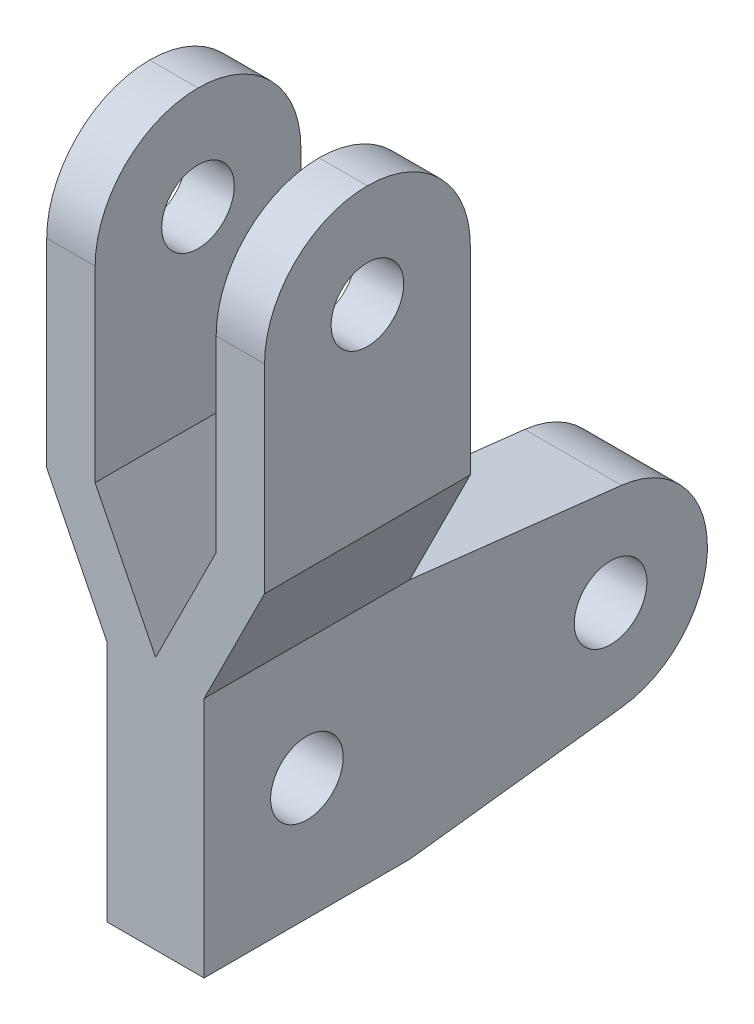
ISO-10303-21;
HEADER;
FILE_DESCRIPTION(('STEP AP214'),'2;1');
FILE_NAME('part.step','',(''),(''),'','','');
FILE_SCHEMA(('AUTOMOTIVE_DESIGN { 1 0 10303 214 1 1 1 1 }'));
ENDSEC;
DATA;
#1=APPLICATION_CONTEXT('core data for automotive mechanical design processes');
#2=APPLICATION_PROTOCOL_DEFINITION('international standard','automotive_design',2000,#1);
#3=PRODUCT_CONTEXT('',#1,'mechanical');
#4=PRODUCT('Part','Part','',(#3));
#5=PRODUCT_RELATED_PRODUCT_CATEGORY('part','',(#4));
#6=PRODUCT_DEFINITION_FORMATION('','',#4);
#7=PRODUCT_DEFINITION_CONTEXT('part definition',#1,'design');
#8=PRODUCT_DEFINITION('design','',#6,#7);
#9=PRODUCT_DEFINITION_SHAPE('','',#8);
#10=(LENGTH_UNIT() NAMED_UNIT(*) SI_UNIT(.MILLI.,.METRE.));
#11=(NAMED_UNIT(*) PLANE_ANGLE_UNIT() SI_UNIT($,.RADIAN.));
#12=(NAMED_UNIT(*) SI_UNIT($,.STERADIAN.) SOLID_ANGLE_UNIT());
#13=UNCERTAINTY_MEASURE_WITH_UNIT(LENGTH_MEASURE(1.E-05),#10,'distance_accuracy_value','');
#14=(GEOMETRIC_REPRESENTATION_CONTEXT(3) GLOBAL_UNCERTAINTY_ASSIGNED_CONTEXT((#13)) GLOBAL_UNIT_ASSIGNED_CONTEXT((#10,
#11,#12)) REPRESENTATION_CONTEXT('',''));
#15=CARTESIAN_POINT('',(0.,0.,0.));
#16=DIRECTION('',(0.,0.,1.));
#17=DIRECTION('',(1.,0.,0.));
#18=AXIS2_PLACEMENT_3D('',#15,#16,#17);
#19=CARTESIAN_POINT('',(-3.17499999999999,-11.6902420857191,10.795));
#20=DIRECTION('',(-1.,0.,0.));
#21=DIRECTION('',(0.,-1.,0.));
#22=AXIS2_PLACEMENT_3D('',#19,#20,#21);
#23=PLANE('',#22);
#24=CARTESIAN_POINT('',(-3.175,-1.84774208571908,5.3975));
#25=DIRECTION('',(-1.,0.,0.));
#26=DIRECTION('',(0.,-1.,0.));
#27=AXIS2_PLACEMENT_3D('',#24,#25,#26);
#28=CIRCLE('',#27,1.905);
#29=CARTESIAN_POINT('',(-3.175,-3.75274208571908,5.3975));
#30=VERTEX_POINT('',#29);
#31=EDGE_CURVE('E210',#30,#30,#28,.T.);
#32=ORIENTED_EDGE('',*,*,#31,.T.);
#33=EDGE_LOOP('',(#32));
#34=FACE_BOUND('',#33,.T.);
#35=DIRECTION('',(0.,1.,0.));
#36=VECTOR('',#35,1.);
#37=CARTESIAN_POINT('',(-3.17499999999999,-11.6902420857191,0.));
#38=LINE('',#37,#36);
#39=CARTESIAN_POINT('',(-3.17499999999999,-11.6902420857191,0.));
#40=VERTEX_POINT('',#39);
#41=CARTESIAN_POINT('',(-3.175,-1.84774208571909,0.));
#42=VERTEX_POINT('',#41);
#43=EDGE_CURVE('E213',#40,#42,#38,.T.);
#44=ORIENTED_EDGE('',*,*,#43,.T.);
#45=CARTESIAN_POINT('',(-3.175,-1.84774208571909,5.3975));
#46=DIRECTION('',(-1.,0.,0.));
#47=DIRECTION('',(0.,-1.,0.));
#48=AXIS2_PLACEMENT_3D('',#45,#46,#47);
#49=CIRCLE('',#48,5.3975);
#50=CARTESIAN_POINT('',(-3.175,3.54975791428091,5.3975));
#51=VERTEX_POINT('',#50);
#52=EDGE_CURVE('E11',#42,#51,#49,.F.);
#53=ORIENTED_EDGE('',*,*,#52,.T.);
#54=CARTESIAN_POINT('',(-3.175,-1.84774208571909,5.3975));
#55=DIRECTION('',(-1.,0.,0.));
#56=DIRECTION('',(0.,-1.,0.));
#57=AXIS2_PLACEMENT_3D('',#54,#55,#56);
#58=CIRCLE('',#57,5.3975);
#59=CARTESIAN_POINT('',(-3.175,-1.84774208571909,10.795));
#60=VERTEX_POINT('',#59);
#61=EDGE_CURVE('E50',#51,#60,#58,.F.);
#62=ORIENTED_EDGE('',*,*,#61,.T.);
#63=DIRECTION('',(0.,1.,0.));
#64=VECTOR('',#63,1.);
#65=CARTESIAN_POINT('',(-3.17499999999999,-11.6902420857191,10.795));
#66=LINE('',#65,#64);
#67=CARTESIAN_POINT('',(-3.17499999999999,-11.6902420857191,10.795));
#68=VERTEX_POINT('',#67);
#69=EDGE_CURVE('E214',#68,#60,#66,.T.);
#70=ORIENTED_EDGE('',*,*,#69,.F.);
#71=DIRECTION('',(0.,0.,-1.));
#72=VECTOR('',#71,1.);
#73=CARTESIAN_POINT('',(-3.17499999999999,-11.6902420857191,10.795));
#74=LINE('',#73,#72);
#75=EDGE_CURVE('E243',#68,#40,#74,.T.);
#76=ORIENTED_EDGE('',*,*,#75,.T.);
#77=EDGE_LOOP('',(#44,#53,#62,#70,#76));
#78=FACE_BOUND('',#77,.T.);
#79=ADVANCED_FACE('F41',(#34,#78),#23,.F.);
#80=CARTESIAN_POINT('',(-5.71499999999999,3.54975791428092,10.795));
#81=DIRECTION('',(1.,0.,0.));
#82=DIRECTION('',(0.,1.,0.));
#83=AXIS2_PLACEMENT_3D('',#80,#81,#82);
#84=PLANE('',#83);
#85=CARTESIAN_POINT('',(-5.715,-1.84774208571908,5.3975));
#86=DIRECTION('',(1.,0.,0.));
#87=DIRECTION('',(0.,1.,0.));
#88=AXIS2_PLACEMENT_3D('',#85,#86,#87);
#89=CIRCLE('',#88,1.905);
#90=CARTESIAN_POINT('',(-5.715,0.0572579142809259,5.3975));
#91=VERTEX_POINT('',#90);
#92=EDGE_CURVE('E201',#91,#91,#89,.T.);
#93=ORIENTED_EDGE('',*,*,#92,.T.);
#94=EDGE_LOOP('',(#93));
#95=FACE_BOUND('',#94,.T.);
#96=CARTESIAN_POINT('',(-5.715,-1.84774208571908,5.3975));
#97=DIRECTION('',(1.,0.,0.));
#98=DIRECTION('',(0.,1.,0.));
#99=AXIS2_PLACEMENT_3D('',#96,#97,#98);
#100=CIRCLE('',#99,5.3975);
#101=CARTESIAN_POINT('',(-5.715,-1.84774208571908,10.795));
#102=VERTEX_POINT('',#101);
#103=CARTESIAN_POINT('',(-5.71499999999999,3.54975791428092,5.3975));
#104=VERTEX_POINT('',#103);
#105=EDGE_CURVE('E64',#102,#104,#100,.F.);
#106=ORIENTED_EDGE('',*,*,#105,.T.);
#107=CARTESIAN_POINT('',(-5.715,-1.84774208571908,5.3975));
#108=DIRECTION('',(1.,0.,0.));
#109=DIRECTION('',(0.,1.,0.));
#110=AXIS2_PLACEMENT_3D('',#107,#108,#109);
#111=CIRCLE('',#110,5.3975);
#112=CARTESIAN_POINT('',(-5.715,-1.84774208571908,0.));
#113=VERTEX_POINT('',#112);
#114=EDGE_CURVE('E307',#104,#113,#111,.F.);
#115=ORIENTED_EDGE('',*,*,#114,.T.);
#116=DIRECTION('',(0.,-1.,0.));
#117=VECTOR('',#116,1.);
#118=CARTESIAN_POINT('',(-5.71499999999999,3.54975791428092,0.));
#119=LINE('',#118,#117);
#120=CARTESIAN_POINT('',(-5.715,-12.2898547485685,0.));
#121=VERTEX_POINT('',#120);
#122=EDGE_CURVE('E245',#113,#121,#119,.T.);
#123=ORIENTED_EDGE('',*,*,#122,.T.);
#124=DIRECTION('',(0.,0.,-1.));
#125=VECTOR('',#124,1.);
#126=CARTESIAN_POINT('',(-5.715,-12.2898547485685,10.795));
#127=LINE('',#126,#125);
#128=CARTESIAN_POINT('',(-5.715,-12.2898547485685,10.795));
#129=VERTEX_POINT('',#128);
#130=EDGE_CURVE('E283',#129,#121,#127,.T.);
#131=ORIENTED_EDGE('',*,*,#130,.F.);
#132=DIRECTION('',(0.,-1.,0.));
#133=VECTOR('',#132,1.);
#134=CARTESIAN_POINT('',(-5.71499999999999,3.54975791428092,10.795));
#135=LINE('',#134,#133);
#136=EDGE_CURVE('E217',#102,#129,#135,.T.);
#137=ORIENTED_EDGE('',*,*,#136,.F.);
#138=EDGE_LOOP('',(#106,#115,#123,#131,#137));
#139=FACE_BOUND('',#138,.T.);
#140=ADVANCED_FACE('F339',(#95,#139),#84,.F.);
#141=CARTESIAN_POINT('',(-5.715,-12.2898547485685,10.795));
#142=DIRECTION('',(0.894427190999916,0.447213595499957,0.));
#143=DIRECTION('',(-0.447213595499957,0.894427190999916,0.));
#144=AXIS2_PLACEMENT_3D('',#141,#142,#143);
#145=PLANE('',#144);
#146=DIRECTION('',(0.447213595499957,-0.894427190999916,0.));
#147=VECTOR('',#146,1.);
#148=CARTESIAN_POINT('',(-5.715,-12.2898547485685,0.));
#149=LINE('',#148,#147);
#150=CARTESIAN_POINT('',(-2.54,-18.6398547485685,0.));
#151=VERTEX_POINT('',#150);
#152=EDGE_CURVE('E247',#121,#151,#149,.T.);
#153=ORIENTED_EDGE('',*,*,#152,.T.);
#154=DIRECTION('',(0.,0.,-1.));
#155=VECTOR('',#154,1.);
#156=CARTESIAN_POINT('',(-2.54,-18.6398547485685,10.795));
#157=LINE('',#156,#155);
#158=CARTESIAN_POINT('',(-2.54,-18.6398547485685,10.795));
#159=VERTEX_POINT('',#158);
#160=EDGE_CURVE('E281',#159,#151,#157,.T.);
#161=ORIENTED_EDGE('',*,*,#160,.F.);
#162=DIRECTION('',(0.447213595499957,-0.894427190999916,0.));
#163=VECTOR('',#162,1.);
#164=CARTESIAN_POINT('',(-5.715,-12.2898547485685,10.795));
#165=LINE('',#164,#163);
#166=EDGE_CURVE('E220',#129,#159,#165,.T.);
#167=ORIENTED_EDGE('',*,*,#166,.F.);
#168=ORIENTED_EDGE('',*,*,#130,.T.);
#169=EDGE_LOOP('',(#153,#161,#167,#168));
#170=FACE_BOUND('',#169,.T.);
#171=ADVANCED_FACE('F342',(#170),#145,.F.);
#172=CARTESIAN_POINT('',(-2.54,-31.3398547485685,10.795));
#173=DIRECTION('',(-1.,0.,0.));
#174=DIRECTION('',(0.,-1.,0.));
#175=AXIS2_PLACEMENT_3D('',#172,#173,#174);
#176=PLANE('',#175);
#177=CARTESIAN_POINT('',(-2.54,-24.9515820857191,5.3975));
#178=DIRECTION('',(-1.,0.,0.));
#179=DIRECTION('',(0.,-1.,0.));
#180=AXIS2_PLACEMENT_3D('',#177,#178,#179);
#181=CIRCLE('',#180,1.905);
#182=CARTESIAN_POINT('',(-2.54,-26.8565820857191,5.3975));
#183=VERTEX_POINT('',#182);
#184=EDGE_CURVE('E198',#183,#183,#181,.T.);
#185=ORIENTED_EDGE('',*,*,#184,.F.);
#186=EDGE_LOOP('',(#185));
#187=FACE_BOUND('',#186,.T.);
#188=ORIENTED_EDGE('',*,*,#160,.T.);
#189=DIRECTION('',(0.,0.113040391842015,0.993590393377575));
#190=VECTOR('',#189,1.);
#191=CARTESIAN_POINT('',(-2.54,-19.904142887361,-11.1127051905574));
#192=LINE('',#191,#190);
#193=CARTESIAN_POINT('',(-2.54,-19.904142887361,-11.1127051905574));
#194=VERTEX_POINT('',#193);
#195=EDGE_CURVE('E168',#194,#151,#192,.T.);
#196=ORIENTED_EDGE('',*,*,#195,.F.);
#197=CARTESIAN_POINT('',(-2.54,-24.9515820857191,-10.53846));
#198=DIRECTION('',(-1.,0.,0.));
#199=DIRECTION('',(0.,-1.,0.));
#200=AXIS2_PLACEMENT_3D('',#197,#198,#199);
#201=CIRCLE('',#200,5.08);
#202=CARTESIAN_POINT('',(-2.54,-29.9950093233535,-11.1469348956916));
#203=VERTEX_POINT('',#202);
#204=EDGE_CURVE('E160',#203,#194,#201,.F.);
#205=ORIENTED_EDGE('',*,*,#204,.F.);
#206=DIRECTION('',(0.,0.119778522773944,-0.992800637329616));
#207=VECTOR('',#206,1.);
#208=CARTESIAN_POINT('',(-2.54,-31.3398547485685,0.));
#209=LINE('',#208,#207);
#210=CARTESIAN_POINT('',(-2.54,-31.3398547485685,0.));
#211=VERTEX_POINT('',#210);
#212=EDGE_CURVE('E166',#211,#203,#209,.T.);
#213=ORIENTED_EDGE('',*,*,#212,.F.);
#214=DIRECTION('',(0.,0.,-1.));
#215=VECTOR('',#214,1.);
#216=CARTESIAN_POINT('',(-2.54,-31.3398547485685,10.795));
#217=LINE('',#216,#215);
#218=CARTESIAN_POINT('',(-2.54,-31.3398547485685,10.795));
#219=VERTEX_POINT('',#218);
#220=EDGE_CURVE('E279',#219,#211,#217,.T.);
#221=ORIENTED_EDGE('',*,*,#220,.F.);
#222=DIRECTION('',(0.,1.,0.));
#223=VECTOR('',#222,1.);
#224=CARTESIAN_POINT('',(-2.54,-31.3398547485685,10.795));
#225=LINE('',#224,#223);
#226=EDGE_CURVE('E222',#219,#159,#225,.T.);
#227=ORIENTED_EDGE('',*,*,#226,.T.);
#228=EDGE_LOOP('',(#188,#196,#205,#213,#221,#227));
#229=FACE_BOUND('',#228,.T.);
#230=CARTESIAN_POINT('',(-2.54,-24.9515820857191,-10.53846));
#231=DIRECTION('',(-1.,0.,0.));
#232=DIRECTION('',(0.,-1.,0.));
#233=AXIS2_PLACEMENT_3D('',#230,#231,#232);
#234=CIRCLE('',#233,1.905);
#235=CARTESIAN_POINT('',(-2.54,-26.8565820857191,-10.53846));
#236=VERTEX_POINT('',#235);
#237=EDGE_CURVE('E444',#236,#236,#234,.F.);
#238=ORIENTED_EDGE('',*,*,#237,.T.);
#239=EDGE_LOOP('',(#238));
#240=FACE_BOUND('',#239,.T.);
#241=ADVANCED_FACE('F163',(#187,#229,#240),#176,.T.);
#242=CARTESIAN_POINT('',(2.54,-31.3398547485685,10.795));
#243=DIRECTION('',(0.,-1.,0.));
#244=DIRECTION('',(0.,0.,-1.));
#245=AXIS2_PLACEMENT_3D('',#242,#243,#244);
#246=PLANE('',#245);
#247=DIRECTION('',(-1.,0.,0.));
#248=VECTOR('',#247,1.);
#249=CARTESIAN_POINT('',(2.54,-31.3398547485685,0.));
#250=LINE('',#249,#248);
#251=CARTESIAN_POINT('',(2.54,-31.3398547485685,0.));
#252=VERTEX_POINT('',#251);
#253=EDGE_CURVE('E183',#252,#211,#250,.T.);
#254=ORIENTED_EDGE('',*,*,#253,.F.);
#255=DIRECTION('',(0.,0.,-1.));
#256=VECTOR('',#255,1.);
#257=CARTESIAN_POINT('',(2.54,-31.3398547485685,10.795));
#258=LINE('',#257,#256);
#259=CARTESIAN_POINT('',(2.54,-31.3398547485685,10.795));
#260=VERTEX_POINT('',#259);
#261=EDGE_CURVE('E275',#260,#252,#258,.T.);
#262=ORIENTED_EDGE('',*,*,#261,.F.);
#263=DIRECTION('',(-1.,0.,0.));
#264=VECTOR('',#263,1.);
#265=CARTESIAN_POINT('',(2.54,-31.3398547485685,10.795));
#266=LINE('',#265,#264);
#267=EDGE_CURVE('E225',#260,#219,#266,.T.);
#268=ORIENTED_EDGE('',*,*,#267,.T.);
#269=ORIENTED_EDGE('',*,*,#220,.T.);
#270=EDGE_LOOP('',(#254,#262,#268,#269));
#271=FACE_BOUND('',#270,.T.);
#272=ADVANCED_FACE('F347',(#271),#246,.T.);
#273=CARTESIAN_POINT('',(2.54,-31.3398547485685,10.795));
#274=DIRECTION('',(-1.,0.,0.));
#275=DIRECTION('',(0.,-1.,0.));
#276=AXIS2_PLACEMENT_3D('',#273,#274,#275);
#277=PLANE('',#276);
#278=CARTESIAN_POINT('',(2.54,-24.9515820857191,5.3975));
#279=DIRECTION('',(1.,0.,0.));
#280=DIRECTION('',(0.,1.,0.));
#281=AXIS2_PLACEMENT_3D('',#278,#279,#280);
#282=CIRCLE('',#281,1.905);
#283=CARTESIAN_POINT('',(2.54,-23.0465820857191,5.3975));
#284=VERTEX_POINT('',#283);
#285=EDGE_CURVE('E194',#284,#284,#282,.T.);
#286=ORIENTED_EDGE('',*,*,#285,.F.);
#287=EDGE_LOOP('',(#286));
#288=FACE_BOUND('',#287,.T.);
#289=ORIENTED_EDGE('',*,*,#261,.T.);
#290=DIRECTION('',(0.,0.119778522773944,-0.992800637329616));
#291=VECTOR('',#290,1.);
#292=CARTESIAN_POINT('',(2.54,-31.3398547485685,0.));
#293=LINE('',#292,#291);
#294=CARTESIAN_POINT('',(2.54,-29.9950093233535,-11.1469348956916));
#295=VERTEX_POINT('',#294);
#296=EDGE_CURVE('E445',#252,#295,#293,.T.);
#297=ORIENTED_EDGE('',*,*,#296,.T.);
#298=CARTESIAN_POINT('',(2.54,-24.9515820857191,-10.53846));
#299=DIRECTION('',(1.,0.,0.));
#300=DIRECTION('',(0.,1.,0.));
#301=AXIS2_PLACEMENT_3D('',#298,#299,#300);
#302=CIRCLE('',#301,5.08);
#303=CARTESIAN_POINT('',(2.54,-19.904142887361,-11.1127051905574));
#304=VERTEX_POINT('',#303);
#305=EDGE_CURVE('E177',#295,#304,#302,.T.);
#306=ORIENTED_EDGE('',*,*,#305,.T.);
#307=DIRECTION('',(0.,0.113040391842015,0.993590393377575));
#308=VECTOR('',#307,1.);
#309=CARTESIAN_POINT('',(2.54,-19.904142887361,-11.1127051905574));
#310=LINE('',#309,#308);
#311=CARTESIAN_POINT('',(2.54,-18.6398547485685,0.));
#312=VERTEX_POINT('',#311);
#313=EDGE_CURVE('E185',#304,#312,#310,.T.);
#314=ORIENTED_EDGE('',*,*,#313,.T.);
#315=DIRECTION('',(0.,0.,-1.));
#316=VECTOR('',#315,1.);
#317=CARTESIAN_POINT('',(2.54,-18.6398547485685,10.795));
#318=LINE('',#317,#316);
#319=CARTESIAN_POINT('',(2.54,-18.6398547485685,10.795));
#320=VERTEX_POINT('',#319);
#321=EDGE_CURVE('E272',#320,#312,#318,.T.);
#322=ORIENTED_EDGE('',*,*,#321,.F.);
#323=DIRECTION('',(0.,1.,0.));
#324=VECTOR('',#323,1.);
#325=CARTESIAN_POINT('',(2.54,-31.3398547485685,10.795));
#326=LINE('',#325,#324);
#327=EDGE_CURVE('E228',#260,#320,#326,.T.);
#328=ORIENTED_EDGE('',*,*,#327,.F.);
#329=EDGE_LOOP('',(#289,#297,#306,#314,#322,#328));
#330=FACE_BOUND('',#329,.T.);
#331=CARTESIAN_POINT('',(2.54,-24.9515820857191,-10.53846));
#332=DIRECTION('',(1.,0.,0.));
#333=DIRECTION('',(0.,1.,0.));
#334=AXIS2_PLACEMENT_3D('',#331,#332,#333);
#335=CIRCLE('',#334,1.905);
#336=CARTESIAN_POINT('',(2.54,-23.0465820857191,-10.53846));
#337=VERTEX_POINT('',#336);
#338=EDGE_CURVE('E441',#337,#337,#335,.T.);
#339=ORIENTED_EDGE('',*,*,#338,.F.);
#340=EDGE_LOOP('',(#339));
#341=FACE_BOUND('',#340,.T.);
#342=ADVANCED_FACE('F351',(#288,#330,#341),#277,.F.);
#343=CARTESIAN_POINT('',(5.71499999999999,-12.2898547485685,10.795));
#344=DIRECTION('',(0.894427190999916,-0.447213595499957,0.));
#345=DIRECTION('',(0.447213595499957,0.894427190999916,0.));
#346=AXIS2_PLACEMENT_3D('',#343,#344,#345);
#347=PLANE('',#346);
#348=DIRECTION('',(-0.447213595499957,-0.894427190999916,0.));
#349=VECTOR('',#348,1.);
#350=CARTESIAN_POINT('',(5.71499999999999,-12.2898547485685,0.));
#351=LINE('',#350,#349);
#352=CARTESIAN_POINT('',(5.71499999999999,-12.2898547485685,0.));
#353=VERTEX_POINT('',#352);
#354=EDGE_CURVE('E251',#353,#312,#351,.T.);
#355=ORIENTED_EDGE('',*,*,#354,.F.);
#356=DIRECTION('',(0.,0.,-1.));
#357=VECTOR('',#356,1.);
#358=CARTESIAN_POINT('',(5.71499999999999,-12.2898547485685,10.795));
#359=LINE('',#358,#357);
#360=CARTESIAN_POINT('',(5.71499999999999,-12.2898547485685,10.795));
#361=VERTEX_POINT('',#360);
#362=EDGE_CURVE('E269',#361,#353,#359,.T.);
#363=ORIENTED_EDGE('',*,*,#362,.F.);
#364=DIRECTION('',(-0.447213595499957,-0.894427190999916,0.));
#365=VECTOR('',#364,1.);
#366=CARTESIAN_POINT('',(5.71499999999999,-12.2898547485685,10.795));
#367=LINE('',#366,#365);
#368=EDGE_CURVE('E230',#361,#320,#367,.T.);
#369=ORIENTED_EDGE('',*,*,#368,.T.);
#370=ORIENTED_EDGE('',*,*,#321,.T.);
#371=EDGE_LOOP('',(#355,#363,#369,#370));
#372=FACE_BOUND('',#371,.T.);
#373=ADVANCED_FACE('F358',(#372),#347,.T.);
#374=CARTESIAN_POINT('',(5.715,3.54975791428092,10.795));
#375=DIRECTION('',(1.,0.,0.));
#376=DIRECTION('',(0.,1.,0.));
#377=AXIS2_PLACEMENT_3D('',#374,#375,#376);
#378=PLANE('',#377);
#379=CARTESIAN_POINT('',(5.71499999999999,-1.84774208571908,5.3975));
#380=DIRECTION('',(1.,0.,0.));
#381=DIRECTION('',(0.,1.,0.));
#382=AXIS2_PLACEMENT_3D('',#379,#380,#381);
#383=CIRCLE('',#382,1.905);
#384=CARTESIAN_POINT('',(5.715,0.0572579142809223,5.3975));
#385=VERTEX_POINT('',#384);
#386=EDGE_CURVE('E205',#385,#385,#383,.T.);
#387=ORIENTED_EDGE('',*,*,#386,.F.);
#388=EDGE_LOOP('',(#387));
#389=FACE_BOUND('',#388,.T.);
#390=CARTESIAN_POINT('',(5.71499999999999,-1.84774208571908,5.3975));
#391=DIRECTION('',(1.,0.,0.));
#392=DIRECTION('',(0.,1.,0.));
#393=AXIS2_PLACEMENT_3D('',#390,#391,#392);
#394=CIRCLE('',#393,5.3975);
#395=CARTESIAN_POINT('',(5.71499999999999,-1.84774208571908,0.));
#396=VERTEX_POINT('',#395);
#397=CARTESIAN_POINT('',(5.715,3.54975791428092,5.3975));
#398=VERTEX_POINT('',#397);
#399=EDGE_CURVE('E286',#396,#398,#394,.T.);
#400=ORIENTED_EDGE('',*,*,#399,.T.);
#401=CARTESIAN_POINT('',(5.71499999999999,-1.84774208571908,5.3975));
#402=DIRECTION('',(1.,0.,0.));
#403=DIRECTION('',(0.,1.,0.));
#404=AXIS2_PLACEMENT_3D('',#401,#402,#403);
#405=CIRCLE('',#404,5.3975);
#406=CARTESIAN_POINT('',(5.71499999999999,-1.84774208571908,10.795));
#407=VERTEX_POINT('',#406);
#408=EDGE_CURVE('E290',#398,#407,#405,.T.);
#409=ORIENTED_EDGE('',*,*,#408,.T.);
#410=DIRECTION('',(0.,-1.,0.));
#411=VECTOR('',#410,1.);
#412=CARTESIAN_POINT('',(5.715,3.54975791428092,10.795));
#413=LINE('',#412,#411);
#414=EDGE_CURVE('E233',#407,#361,#413,.T.);
#415=ORIENTED_EDGE('',*,*,#414,.T.);
#416=ORIENTED_EDGE('',*,*,#362,.T.);
#417=DIRECTION('',(0.,-1.,0.));
#418=VECTOR('',#417,1.);
#419=CARTESIAN_POINT('',(5.715,3.54975791428092,0.));
#420=LINE('',#419,#418);
#421=EDGE_CURVE('E254',#396,#353,#420,.T.);
#422=ORIENTED_EDGE('',*,*,#421,.F.);
#423=EDGE_LOOP('',(#400,#409,#415,#416,#422));
#424=FACE_BOUND('',#423,.T.);
#425=ADVANCED_FACE('F361',(#389,#424),#378,.T.);
#426=CARTESIAN_POINT('',(3.17499999999999,-11.6902420857191,10.795));
#427=DIRECTION('',(-1.,0.,0.));
#428=DIRECTION('',(0.,-1.,0.));
#429=AXIS2_PLACEMENT_3D('',#426,#427,#428);
#430=PLANE('',#429);
#431=CARTESIAN_POINT('',(3.17499999999999,-1.84774208571908,5.3975));
#432=DIRECTION('',(-1.,0.,0.));
#433=DIRECTION('',(0.,-1.,0.));
#434=AXIS2_PLACEMENT_3D('',#431,#432,#433);
#435=CIRCLE('',#434,1.905);
#436=CARTESIAN_POINT('',(3.17499999999999,-3.75274208571908,5.3975));
#437=VERTEX_POINT('',#436);
#438=EDGE_CURVE('E204',#437,#437,#435,.T.);
#439=ORIENTED_EDGE('',*,*,#438,.F.);
#440=EDGE_LOOP('',(#439));
#441=FACE_BOUND('',#440,.T.);
#442=DIRECTION('',(0.,1.,0.));
#443=VECTOR('',#442,1.);
#444=CARTESIAN_POINT('',(3.17499999999999,-11.6902420857191,10.795));
#445=LINE('',#444,#443);
#446=CARTESIAN_POINT('',(3.17499999999999,-11.6902420857191,10.795));
#447=VERTEX_POINT('',#446);
#448=CARTESIAN_POINT('',(3.17499999999999,-1.84774208571908,10.795));
#449=VERTEX_POINT('',#448);
#450=EDGE_CURVE('E235',#447,#449,#445,.T.);
#451=ORIENTED_EDGE('',*,*,#450,.T.);
#452=CARTESIAN_POINT('',(3.17499999999999,-1.84774208571908,5.3975));
#453=DIRECTION('',(-1.,0.,0.));
#454=DIRECTION('',(0.,-1.,0.));
#455=AXIS2_PLACEMENT_3D('',#452,#453,#454);
#456=CIRCLE('',#455,5.3975);
#457=CARTESIAN_POINT('',(3.175,3.54975791428092,5.3975));
#458=VERTEX_POINT('',#457);
#459=EDGE_CURVE('E299',#449,#458,#456,.T.);
#460=ORIENTED_EDGE('',*,*,#459,.T.);
#461=CARTESIAN_POINT('',(3.17499999999999,-1.84774208571908,5.3975));
#462=DIRECTION('',(-1.,0.,0.));
#463=DIRECTION('',(0.,-1.,0.));
#464=AXIS2_PLACEMENT_3D('',#461,#462,#463);
#465=CIRCLE('',#464,5.3975);
#466=CARTESIAN_POINT('',(3.17499999999999,-1.84774208571908,0.));
#467=VERTEX_POINT('',#466);
#468=EDGE_CURVE('E297',#458,#467,#465,.T.);
#469=ORIENTED_EDGE('',*,*,#468,.T.);
#470=DIRECTION('',(0.,1.,0.));
#471=VECTOR('',#470,1.);
#472=CARTESIAN_POINT('',(3.17499999999999,-11.6902420857191,0.));
#473=LINE('',#472,#471);
#474=CARTESIAN_POINT('',(3.17499999999999,-11.6902420857191,0.));
#475=VERTEX_POINT('',#474);
#476=EDGE_CURVE('E256',#475,#467,#473,.T.);
#477=ORIENTED_EDGE('',*,*,#476,.F.);
#478=DIRECTION('',(0.,0.,-1.));
#479=VECTOR('',#478,1.);
#480=CARTESIAN_POINT('',(3.17499999999999,-11.6902420857191,10.795));
#481=LINE('',#480,#479);
#482=EDGE_CURVE('E267',#447,#475,#481,.T.);
#483=ORIENTED_EDGE('',*,*,#482,.F.);
#484=EDGE_LOOP('',(#451,#460,#469,#477,#483));
#485=FACE_BOUND('',#484,.T.);
#486=ADVANCED_FACE('F365',(#441,#485),#430,.T.);
#487=CARTESIAN_POINT('',(0.,-18.0402420857191,10.795));
#488=DIRECTION('',(-0.894427190999916,0.447213595499958,0.));
#489=DIRECTION('',(-0.447213595499958,-0.894427190999916,0.));
#490=AXIS2_PLACEMENT_3D('',#487,#488,#489);
#491=PLANE('',#490);
#492=DIRECTION('',(0.447213595499958,0.894427190999916,0.));
#493=VECTOR('',#492,1.);
#494=CARTESIAN_POINT('',(0.,-18.0402420857191,0.));
#495=LINE('',#494,#493);
#496=CARTESIAN_POINT('',(0.,-18.0402420857191,0.));
#497=VERTEX_POINT('',#496);
#498=EDGE_CURVE('E259',#497,#475,#495,.T.);
#499=ORIENTED_EDGE('',*,*,#498,.F.);
#500=DIRECTION('',(0.,0.,-1.));
#501=VECTOR('',#500,1.);
#502=CARTESIAN_POINT('',(0.,-18.0402420857191,10.795));
#503=LINE('',#502,#501);
#504=CARTESIAN_POINT('',(0.,-18.0402420857191,10.795));
#505=VERTEX_POINT('',#504);
#506=EDGE_CURVE('E265',#505,#497,#503,.T.);
#507=ORIENTED_EDGE('',*,*,#506,.F.);
#508=DIRECTION('',(0.447213595499958,0.894427190999916,0.));
#509=VECTOR('',#508,1.);
#510=CARTESIAN_POINT('',(0.,-18.0402420857191,10.795));
#511=LINE('',#510,#509);
#512=EDGE_CURVE('E238',#505,#447,#511,.T.);
#513=ORIENTED_EDGE('',*,*,#512,.T.);
#514=ORIENTED_EDGE('',*,*,#482,.T.);
#515=EDGE_LOOP('',(#499,#507,#513,#514));
#516=FACE_BOUND('',#515,.T.);
#517=ADVANCED_FACE('F369',(#516),#491,.T.);
#518=CARTESIAN_POINT('',(0.,-18.0402420857191,10.795));
#519=DIRECTION('',(-0.894427190999916,-0.447213595499958,0.));
#520=DIRECTION('',(0.447213595499958,-0.894427190999916,0.));
#521=AXIS2_PLACEMENT_3D('',#518,#519,#520);
#522=PLANE('',#521);
#523=DIRECTION('',(-0.447213595499958,0.894427190999916,0.));
#524=VECTOR('',#523,1.);
#525=CARTESIAN_POINT('',(0.,-18.0402420857191,0.));
#526=LINE('',#525,#524);
#527=EDGE_CURVE('E218',#497,#40,#526,.T.);
#528=ORIENTED_EDGE('',*,*,#527,.T.);
#529=ORIENTED_EDGE('',*,*,#75,.F.);
#530=DIRECTION('',(-0.447213595499958,0.894427190999916,0.));
#531=VECTOR('',#530,1.);
#532=CARTESIAN_POINT('',(0.,-18.0402420857191,10.795));
#533=LINE('',#532,#531);
#534=EDGE_CURVE('E241',#505,#68,#533,.T.);
#535=ORIENTED_EDGE('',*,*,#534,.F.);
#536=ORIENTED_EDGE('',*,*,#506,.T.);
#537=EDGE_LOOP('',(#528,#529,#535,#536));
#538=FACE_BOUND('',#537,.T.);
#539=ADVANCED_FACE('F329',(#538),#522,.F.);
#540=CARTESIAN_POINT('',(-3.17499999999998,-31.3398547485685,10.795));
#541=DIRECTION('',(0.,0.,1.));
#542=DIRECTION('',(1.,0.,0.));
#543=AXIS2_PLACEMENT_3D('',#540,#541,#542);
#544=PLANE('',#543);
#545=ORIENTED_EDGE('',*,*,#414,.F.);
#546=DIRECTION('',(1.,0.,0.));
#547=VECTOR('',#546,1.);
#548=CARTESIAN_POINT('',(-3.17499999999998,-1.84774208571908,10.795));
#549=LINE('',#548,#547);
#550=EDGE_CURVE('E294',#407,#449,#549,.F.);
#551=ORIENTED_EDGE('',*,*,#550,.T.);
#552=ORIENTED_EDGE('',*,*,#450,.F.);
#553=ORIENTED_EDGE('',*,*,#512,.F.);
#554=ORIENTED_EDGE('',*,*,#534,.T.);
#555=ORIENTED_EDGE('',*,*,#69,.T.);
#556=DIRECTION('',(-1.,0.,0.));
#557=VECTOR('',#556,1.);
#558=CARTESIAN_POINT('',(-5.71500000000001,-1.84774208571908,10.795));
#559=LINE('',#558,#557);
#560=EDGE_CURVE('E292',#60,#102,#559,.T.);
#561=ORIENTED_EDGE('',*,*,#560,.T.);
#562=ORIENTED_EDGE('',*,*,#136,.T.);
#563=ORIENTED_EDGE('',*,*,#166,.T.);
#564=ORIENTED_EDGE('',*,*,#226,.F.);
#565=ORIENTED_EDGE('',*,*,#267,.F.);
#566=ORIENTED_EDGE('',*,*,#327,.T.);
#567=ORIENTED_EDGE('',*,*,#368,.F.);
#568=EDGE_LOOP('',(#545,#551,#552,#553,#554,#555,#561,#562,#563,#564,#565,#566,#567));
#569=FACE_BOUND('',#568,.T.);
#570=ADVANCED_FACE('F323',(#569),#544,.T.);
#571=CARTESIAN_POINT('',(-3.17499999999998,-31.3398547485685,0.));
#572=DIRECTION('',(0.,0.,1.));
#573=DIRECTION('',(1.,0.,0.));
#574=AXIS2_PLACEMENT_3D('',#571,#572,#573);
#575=PLANE('',#574);
#576=ORIENTED_EDGE('',*,*,#354,.T.);
#577=DIRECTION('',(1.,0.,0.));
#578=VECTOR('',#577,1.);
#579=CARTESIAN_POINT('',(-22.6702333014697,-18.6398547485685,0.));
#580=LINE('',#579,#578);
#581=EDGE_CURVE('E191',#151,#312,#580,.T.);
#582=ORIENTED_EDGE('',*,*,#581,.F.);
#583=ORIENTED_EDGE('',*,*,#152,.F.);
#584=ORIENTED_EDGE('',*,*,#122,.F.);
#585=DIRECTION('',(-1.,0.,0.));
#586=VECTOR('',#585,1.);
#587=CARTESIAN_POINT('',(-3.17499999999989,-1.84774208571909,0.));
#588=LINE('',#587,#586);
#589=EDGE_CURVE('E301',#113,#42,#588,.F.);
#590=ORIENTED_EDGE('',*,*,#589,.T.);
#591=ORIENTED_EDGE('',*,*,#43,.F.);
#592=ORIENTED_EDGE('',*,*,#527,.F.);
#593=ORIENTED_EDGE('',*,*,#498,.T.);
#594=ORIENTED_EDGE('',*,*,#476,.T.);
#595=DIRECTION('',(1.,0.,0.));
#596=VECTOR('',#595,1.);
#597=CARTESIAN_POINT('',(5.715,-1.84774208571908,0.));
#598=LINE('',#597,#596);
#599=EDGE_CURVE('E304',#467,#396,#598,.T.);
#600=ORIENTED_EDGE('',*,*,#599,.T.);
#601=ORIENTED_EDGE('',*,*,#421,.T.);
#602=EDGE_LOOP('',(#576,#582,#583,#584,#590,#591,#592,#593,#594,#600,#601));
#603=FACE_BOUND('',#602,.T.);
#604=ADVANCED_FACE('F333',(#603),#575,.F.);
#605=CARTESIAN_POINT('',(-5.715,-1.84774208571908,5.3975));
#606=DIRECTION('',(1.,0.,0.));
#607=DIRECTION('',(0.,1.,0.));
#608=AXIS2_PLACEMENT_3D('',#605,#606,#607);
#609=CYLINDRICAL_SURFACE('',#608,1.905);
#610=ORIENTED_EDGE('',*,*,#438,.T.);
#611=EDGE_LOOP('',(#610));
#612=FACE_BOUND('',#611,.T.);
#613=ORIENTED_EDGE('',*,*,#386,.T.);
#614=EDGE_LOOP('',(#613));
#615=FACE_BOUND('',#614,.T.);
#616=ADVANCED_FACE('F381',(#612,#615),#609,.F.);
#617=ORIENTED_EDGE('',*,*,#92,.F.);
#618=EDGE_LOOP('',(#617));
#619=FACE_BOUND('',#618,.T.);
#620=ORIENTED_EDGE('',*,*,#31,.F.);
#621=EDGE_LOOP('',(#620));
#622=FACE_BOUND('',#621,.T.);
#623=ADVANCED_FACE('F374',(#619,#622),#609,.F.);
#624=CARTESIAN_POINT('',(-3.17499999999998,-1.84774208571908,5.3975));
#625=DIRECTION('',(-1.,0.,0.));
#626=DIRECTION('',(0.,0.,1.));
#627=AXIS2_PLACEMENT_3D('',#624,#625,#626);
#628=CYLINDRICAL_SURFACE('',#627,5.3975);
#629=ORIENTED_EDGE('',*,*,#599,.F.);
#630=ORIENTED_EDGE('',*,*,#468,.F.);
#631=DIRECTION('',(1.,0.,0.));
#632=VECTOR('',#631,1.);
#633=CARTESIAN_POINT('',(3.175,3.54975791428092,5.3975));
#634=LINE('',#633,#632);
#635=EDGE_CURVE('E209',#398,#458,#634,.F.);
#636=ORIENTED_EDGE('',*,*,#635,.F.);
#637=ORIENTED_EDGE('',*,*,#399,.F.);
#638=EDGE_LOOP('',(#629,#630,#636,#637));
#639=FACE_BOUND('',#638,.T.);
#640=ADVANCED_FACE('F372',(#639),#628,.T.);
#641=CARTESIAN_POINT('',(3.175,-1.84774208571908,5.3975));
#642=DIRECTION('',(1.,0.,0.));
#643=DIRECTION('',(0.,0.,-1.));
#644=AXIS2_PLACEMENT_3D('',#641,#642,#643);
#645=CYLINDRICAL_SURFACE('',#644,5.3975);
#646=ORIENTED_EDGE('',*,*,#459,.F.);
#647=ORIENTED_EDGE('',*,*,#550,.F.);
#648=ORIENTED_EDGE('',*,*,#408,.F.);
#649=ORIENTED_EDGE('',*,*,#635,.T.);
#650=EDGE_LOOP('',(#646,#647,#648,#649));
#651=FACE_BOUND('',#650,.T.);
#652=ADVANCED_FACE('F363',(#651),#645,.T.);
#653=CARTESIAN_POINT('',(-3.17499999999989,-1.84774208571909,5.3975));
#654=DIRECTION('',(1.,0.,0.));
#655=DIRECTION('',(0.,1.,0.));
#656=AXIS2_PLACEMENT_3D('',#653,#654,#655);
#657=CYLINDRICAL_SURFACE('',#656,5.3975);
#658=ORIENTED_EDGE('',*,*,#560,.F.);
#659=ORIENTED_EDGE('',*,*,#61,.F.);
#660=DIRECTION('',(-1.,0.,0.));
#661=VECTOR('',#660,1.);
#662=CARTESIAN_POINT('',(-3.175,3.54975791428091,5.3975));
#663=LINE('',#662,#661);
#664=EDGE_CURVE('E45',#104,#51,#663,.F.);
#665=ORIENTED_EDGE('',*,*,#664,.F.);
#666=ORIENTED_EDGE('',*,*,#105,.F.);
#667=EDGE_LOOP('',(#658,#659,#665,#666));
#668=FACE_BOUND('',#667,.T.);
#669=ADVANCED_FACE('F43',(#668),#657,.T.);
#670=CARTESIAN_POINT('',(-3.17500000000002,-1.84774208571909,5.3975));
#671=DIRECTION('',(-1.,0.,0.));
#672=DIRECTION('',(0.,-1.,0.));
#673=AXIS2_PLACEMENT_3D('',#670,#671,#672);
#674=CYLINDRICAL_SURFACE('',#673,5.3975);
#675=ORIENTED_EDGE('',*,*,#52,.F.);
#676=ORIENTED_EDGE('',*,*,#589,.F.);
#677=ORIENTED_EDGE('',*,*,#114,.F.);
#678=ORIENTED_EDGE('',*,*,#664,.T.);
#679=EDGE_LOOP('',(#675,#676,#677,#678));
#680=FACE_BOUND('',#679,.T.);
#681=ADVANCED_FACE('F316',(#680),#674,.T.);
#682=CARTESIAN_POINT('',(-5.715,-24.9515820857191,5.3975));
#683=DIRECTION('',(1.,0.,0.));
#684=DIRECTION('',(0.,1.,0.));
#685=AXIS2_PLACEMENT_3D('',#682,#683,#684);
#686=CYLINDRICAL_SURFACE('',#685,1.905);
#687=ORIENTED_EDGE('',*,*,#184,.T.);
#688=EDGE_LOOP('',(#687));
#689=FACE_BOUND('',#688,.T.);
#690=ORIENTED_EDGE('',*,*,#285,.T.);
#691=EDGE_LOOP('',(#690));
#692=FACE_BOUND('',#691,.T.);
#693=ADVANCED_FACE('F421',(#689,#692),#686,.F.);
#694=CARTESIAN_POINT('',(-22.6702333014697,-31.3398547485685,0.));
#695=DIRECTION('',(0.,-0.992800637329616,-0.119778522773944));
#696=DIRECTION('',(0.,0.119778522773944,-0.992800637329616));
#697=AXIS2_PLACEMENT_3D('',#694,#695,#696);
#698=PLANE('',#697);
#699=ORIENTED_EDGE('',*,*,#253,.T.);
#700=ORIENTED_EDGE('',*,*,#212,.T.);
#701=DIRECTION('',(1.,0.,0.));
#702=VECTOR('',#701,1.);
#703=CARTESIAN_POINT('',(-22.6702333014697,-29.9950093233535,-11.1469348956916));
#704=LINE('',#703,#702);
#705=EDGE_CURVE('E172',#203,#295,#704,.T.);
#706=ORIENTED_EDGE('',*,*,#705,.T.);
#707=ORIENTED_EDGE('',*,*,#296,.F.);
#708=EDGE_LOOP('',(#699,#700,#706,#707));
#709=FACE_BOUND('',#708,.T.);
#710=ADVANCED_FACE('F181',(#709),#698,.T.);
#711=CARTESIAN_POINT('',(-22.6702333014697,-24.9515820857191,-10.53846));
#712=DIRECTION('',(1.,0.,0.));
#713=DIRECTION('',(0.,1.,0.));
#714=AXIS2_PLACEMENT_3D('',#711,#712,#713);
#715=CYLINDRICAL_SURFACE('',#714,5.08);
#716=ORIENTED_EDGE('',*,*,#705,.F.);
#717=ORIENTED_EDGE('',*,*,#204,.T.);
#718=DIRECTION('',(1.,0.,0.));
#719=VECTOR('',#718,1.);
#720=CARTESIAN_POINT('',(-22.6702333014697,-19.904142887361,-11.1127051905574));
#721=LINE('',#720,#719);
#722=EDGE_CURVE('E171',#194,#304,#721,.T.);
#723=ORIENTED_EDGE('',*,*,#722,.T.);
#724=ORIENTED_EDGE('',*,*,#305,.F.);
#725=EDGE_LOOP('',(#716,#717,#723,#724));
#726=FACE_BOUND('',#725,.T.);
#727=ADVANCED_FACE('F175',(#726),#715,.T.);
#728=CARTESIAN_POINT('',(-22.6702333014697,-19.904142887361,-11.1127051905574));
#729=DIRECTION('',(0.,0.993590393377575,-0.113040391842015));
#730=DIRECTION('',(0.,0.113040391842015,0.993590393377575));
#731=AXIS2_PLACEMENT_3D('',#728,#729,#730);
#732=PLANE('',#731);
#733=ORIENTED_EDGE('',*,*,#722,.F.);
#734=ORIENTED_EDGE('',*,*,#195,.T.);
#735=ORIENTED_EDGE('',*,*,#581,.T.);
#736=ORIENTED_EDGE('',*,*,#313,.F.);
#737=EDGE_LOOP('',(#733,#734,#735,#736));
#738=FACE_BOUND('',#737,.T.);
#739=ADVANCED_FACE('F429',(#738),#732,.T.);
#740=CARTESIAN_POINT('',(-22.6702333014697,-24.9515820857191,-10.53846));
#741=DIRECTION('',(1.,0.,0.));
#742=DIRECTION('',(0.,1.,0.));
#743=AXIS2_PLACEMENT_3D('',#740,#741,#742);
#744=CYLINDRICAL_SURFACE('',#743,1.905);
#745=ORIENTED_EDGE('',*,*,#338,.T.);
#746=EDGE_LOOP('',(#745));
#747=FACE_BOUND('',#746,.T.);
#748=ORIENTED_EDGE('',*,*,#237,.F.);
#749=EDGE_LOOP('',(#748));
#750=FACE_BOUND('',#749,.T.);
#751=ADVANCED_FACE('F432',(#747,#750),#744,.F.);
#752=CLOSED_SHELL('',(#79,#140,#171,#241,#272,#342,#373,#425,#486,#517,#539,#570,#604,#616,#623,
#640,#652,#669,#681,#693,#710,#727,#739,#751));
#753=MANIFOLD_SOLID_BREP('B2',#752);
#754=ADVANCED_BREP_SHAPE_REPRESENTATION('',(#18,#753),#14);
#755=SHAPE_DEFINITION_REPRESENTATION(#9,#754);
ENDSEC;
END-ISO-10303-21;
